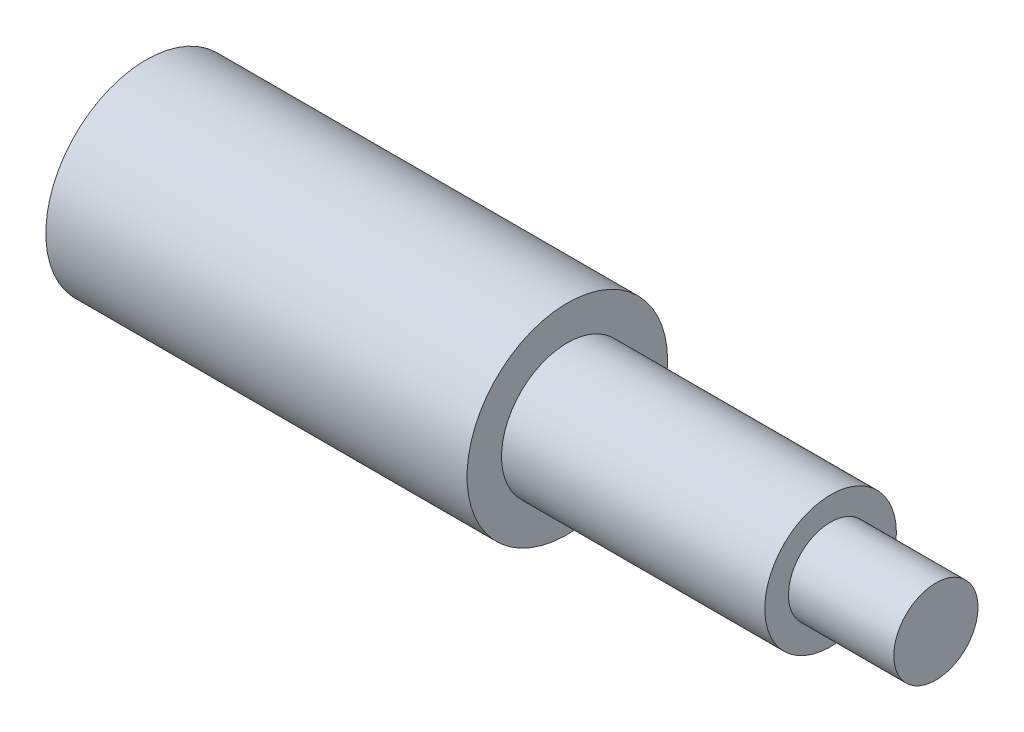
ISO-10303-21;
HEADER;
FILE_DESCRIPTION(('STEP AP214'),'2;1');
FILE_NAME('part.step','',(''),(''),'','','');
FILE_SCHEMA(('AUTOMOTIVE_DESIGN { 1 0 10303 214 1 1 1 1 }'));
ENDSEC;
DATA;
#1=APPLICATION_CONTEXT('core data for automotive mechanical design processes');
#2=APPLICATION_PROTOCOL_DEFINITION('international standard','automotive_design',2000,#1);
#3=PRODUCT_CONTEXT('',#1,'mechanical');
#4=PRODUCT('Part','Part','',(#3));
#5=PRODUCT_RELATED_PRODUCT_CATEGORY('part','',(#4));
#6=PRODUCT_DEFINITION_FORMATION('','',#4);
#7=PRODUCT_DEFINITION_CONTEXT('part definition',#1,'design');
#8=PRODUCT_DEFINITION('design','',#6,#7);
#9=PRODUCT_DEFINITION_SHAPE('','',#8);
#10=(LENGTH_UNIT() NAMED_UNIT(*) SI_UNIT(.MILLI.,.METRE.));
#11=(NAMED_UNIT(*) PLANE_ANGLE_UNIT() SI_UNIT($,.RADIAN.));
#12=(NAMED_UNIT(*) SI_UNIT($,.STERADIAN.) SOLID_ANGLE_UNIT());
#13=UNCERTAINTY_MEASURE_WITH_UNIT(LENGTH_MEASURE(1.E-05),#10,'distance_accuracy_value','');
#14=(GEOMETRIC_REPRESENTATION_CONTEXT(3) GLOBAL_UNCERTAINTY_ASSIGNED_CONTEXT((#13)) GLOBAL_UNIT_ASSIGNED_CONTEXT((#10,
#11,#12)) REPRESENTATION_CONTEXT('',''));
#15=CARTESIAN_POINT('',(0.,0.,0.));
#16=DIRECTION('',(0.,0.,1.));
#17=DIRECTION('',(1.,0.,0.));
#18=AXIS2_PLACEMENT_3D('',#15,#16,#17);
#19=CARTESIAN_POINT('',(300.,0.,0.));
#20=DIRECTION('',(-1.,0.,0.));
#21=DIRECTION('',(0.,0.,1.));
#22=AXIS2_PLACEMENT_3D('',#19,#20,#21);
#23=PLANE('',#22);
#24=CARTESIAN_POINT('',(300.,0.,0.));
#25=DIRECTION('',(-1.,0.,0.));
#26=DIRECTION('',(0.,0.,1.));
#27=AXIS2_PLACEMENT_3D('',#24,#25,#26);
#28=CIRCLE('',#27,12.5);
#29=CARTESIAN_POINT('',(300.,0.,12.5));
#30=VERTEX_POINT('',#29);
#31=EDGE_CURVE('E58',#30,#30,#28,.T.);
#32=ORIENTED_EDGE('',*,*,#31,.F.);
#33=EDGE_LOOP('',(#32));
#34=FACE_BOUND('',#33,.T.);
#35=CARTESIAN_POINT('',(300.,0.,0.));
#36=DIRECTION('',(1.,0.,0.));
#37=DIRECTION('',(0.,0.,-1.));
#38=AXIS2_PLACEMENT_3D('',#35,#36,#37);
#39=CIRCLE('',#38,19.05);
#40=CARTESIAN_POINT('',(300.,0.,-19.05));
#41=VERTEX_POINT('',#40);
#42=EDGE_CURVE('E41',#41,#41,#39,.T.);
#43=ORIENTED_EDGE('',*,*,#42,.F.);
#44=EDGE_LOOP('',(#43));
#45=FACE_BOUND('',#44,.T.);
#46=ADVANCED_FACE('F31',(#34,#45),#23,.T.);
#47=CARTESIAN_POINT('',(450.,0.,0.));
#48=DIRECTION('',(1.,0.,0.));
#49=DIRECTION('',(0.,0.,-1.));
#50=AXIS2_PLACEMENT_3D('',#47,#48,#49);
#51=PLANE('',#50);
#52=CARTESIAN_POINT('',(450.,0.,0.));
#53=DIRECTION('',(1.,0.,0.));
#54=DIRECTION('',(0.,0.,-1.));
#55=AXIS2_PLACEMENT_3D('',#52,#53,#54);
#56=CIRCLE('',#55,8.);
#57=CARTESIAN_POINT('',(450.,0.,-8.));
#58=VERTEX_POINT('',#57);
#59=EDGE_CURVE('E10',#58,#58,#56,.T.);
#60=ORIENTED_EDGE('',*,*,#59,.T.);
#61=EDGE_LOOP('',(#60));
#62=FACE_BOUND('',#61,.T.);
#63=ADVANCED_FACE('F77',(#62),#51,.T.);
#64=CARTESIAN_POINT('',(450.,0.,0.));
#65=DIRECTION('',(-1.,0.,0.));
#66=DIRECTION('',(0.,0.,1.));
#67=AXIS2_PLACEMENT_3D('',#64,#65,#66);
#68=CYLINDRICAL_SURFACE('',#67,8.);
#69=ORIENTED_EDGE('',*,*,#59,.F.);
#70=EDGE_LOOP('',(#69));
#71=FACE_BOUND('',#70,.T.);
#72=CARTESIAN_POINT('',(430.,0.,0.));
#73=DIRECTION('',(1.,0.,0.));
#74=DIRECTION('',(0.,0.,-1.));
#75=AXIS2_PLACEMENT_3D('',#72,#73,#74);
#76=CIRCLE('',#75,8.);
#77=CARTESIAN_POINT('',(430.,0.,-8.));
#78=VERTEX_POINT('',#77);
#79=EDGE_CURVE('E51',#78,#78,#76,.T.);
#80=ORIENTED_EDGE('',*,*,#79,.T.);
#81=EDGE_LOOP('',(#80));
#82=FACE_BOUND('',#81,.T.);
#83=ADVANCED_FACE('F82',(#71,#82),#68,.T.);
#84=CARTESIAN_POINT('',(430.,0.,0.));
#85=DIRECTION('',(1.,0.,0.));
#86=DIRECTION('',(0.,0.,-1.));
#87=AXIS2_PLACEMENT_3D('',#84,#85,#86);
#88=PLANE('',#87);
#89=ORIENTED_EDGE('',*,*,#79,.F.);
#90=EDGE_LOOP('',(#89));
#91=FACE_BOUND('',#90,.T.);
#92=CARTESIAN_POINT('',(430.,0.,0.));
#93=DIRECTION('',(1.,0.,0.));
#94=DIRECTION('',(0.,0.,-1.));
#95=AXIS2_PLACEMENT_3D('',#92,#93,#94);
#96=CIRCLE('',#95,12.5);
#97=CARTESIAN_POINT('',(430.,0.,-12.5));
#98=VERTEX_POINT('',#97);
#99=EDGE_CURVE('E37',#98,#98,#96,.T.);
#100=ORIENTED_EDGE('',*,*,#99,.T.);
#101=EDGE_LOOP('',(#100));
#102=FACE_BOUND('',#101,.T.);
#103=ADVANCED_FACE('F100',(#91,#102),#88,.T.);
#104=CARTESIAN_POINT('',(430.,0.,0.));
#105=DIRECTION('',(-1.,0.,0.));
#106=DIRECTION('',(0.,0.,1.));
#107=AXIS2_PLACEMENT_3D('',#104,#105,#106);
#108=CYLINDRICAL_SURFACE('',#107,12.5);
#109=ORIENTED_EDGE('',*,*,#99,.F.);
#110=EDGE_LOOP('',(#109));
#111=FACE_BOUND('',#110,.T.);
#112=CARTESIAN_POINT('',(380.,0.,0.));
#113=DIRECTION('',(1.,0.,0.));
#114=DIRECTION('',(0.,0.,-1.));
#115=AXIS2_PLACEMENT_3D('',#112,#113,#114);
#116=CIRCLE('',#115,12.5);
#117=CARTESIAN_POINT('',(380.,0.,-12.5));
#118=VERTEX_POINT('',#117);
#119=EDGE_CURVE('E49',#118,#118,#116,.T.);
#120=ORIENTED_EDGE('',*,*,#119,.T.);
#121=EDGE_LOOP('',(#120));
#122=FACE_BOUND('',#121,.T.);
#123=ADVANCED_FACE('F96',(#111,#122),#108,.T.);
#124=CARTESIAN_POINT('',(380.,0.,0.));
#125=DIRECTION('',(1.,0.,0.));
#126=DIRECTION('',(0.,0.,-1.));
#127=AXIS2_PLACEMENT_3D('',#124,#125,#126);
#128=PLANE('',#127);
#129=ORIENTED_EDGE('',*,*,#119,.F.);
#130=EDGE_LOOP('',(#129));
#131=FACE_BOUND('',#130,.T.);
#132=CARTESIAN_POINT('',(380.,0.,0.));
#133=DIRECTION('',(1.,0.,0.));
#134=DIRECTION('',(0.,0.,-1.));
#135=AXIS2_PLACEMENT_3D('',#132,#133,#134);
#136=CIRCLE('',#135,19.05);
#137=CARTESIAN_POINT('',(380.,0.,-19.05));
#138=VERTEX_POINT('',#137);
#139=EDGE_CURVE('E46',#138,#138,#136,.T.);
#140=ORIENTED_EDGE('',*,*,#139,.T.);
#141=EDGE_LOOP('',(#140));
#142=FACE_BOUND('',#141,.T.);
#143=ADVANCED_FACE('F67',(#131,#142),#128,.T.);
#144=CARTESIAN_POINT('',(380.,0.,0.));
#145=DIRECTION('',(-1.,0.,0.));
#146=DIRECTION('',(0.,0.,1.));
#147=AXIS2_PLACEMENT_3D('',#144,#145,#146);
#148=CYLINDRICAL_SURFACE('',#147,19.05);
#149=ORIENTED_EDGE('',*,*,#139,.F.);
#150=EDGE_LOOP('',(#149));
#151=FACE_BOUND('',#150,.T.);
#152=ORIENTED_EDGE('',*,*,#42,.T.);
#153=EDGE_LOOP('',(#152));
#154=FACE_BOUND('',#153,.T.);
#155=ADVANCED_FACE('F69',(#151,#154),#148,.T.);
#156=CARTESIAN_POINT('',(350.,0.,0.));
#157=DIRECTION('',(-1.,0.,0.));
#158=DIRECTION('',(0.,0.,1.));
#159=AXIS2_PLACEMENT_3D('',#156,#157,#158);
#160=CYLINDRICAL_SURFACE('',#159,12.5);
#161=CARTESIAN_POINT('',(350.,0.,0.));
#162=DIRECTION('',(-1.,0.,0.));
#163=DIRECTION('',(0.,0.,1.));
#164=AXIS2_PLACEMENT_3D('',#161,#162,#163);
#165=CIRCLE('',#164,12.5);
#166=CARTESIAN_POINT('',(350.,0.,12.5));
#167=VERTEX_POINT('',#166);
#168=EDGE_CURVE('E53',#167,#167,#165,.T.);
#169=ORIENTED_EDGE('',*,*,#168,.F.);
#170=EDGE_LOOP('',(#169));
#171=FACE_BOUND('',#170,.T.);
#172=ORIENTED_EDGE('',*,*,#31,.T.);
#173=EDGE_LOOP('',(#172));
#174=FACE_BOUND('',#173,.T.);
#175=ADVANCED_FACE('F72',(#171,#174),#160,.F.);
#176=CARTESIAN_POINT('',(350.,0.,0.));
#177=DIRECTION('',(-1.,0.,0.));
#178=DIRECTION('',(0.,0.,1.));
#179=AXIS2_PLACEMENT_3D('',#176,#177,#178);
#180=PLANE('',#179);
#181=ORIENTED_EDGE('',*,*,#168,.T.);
#182=EDGE_LOOP('',(#181));
#183=FACE_BOUND('',#182,.T.);
#184=ADVANCED_FACE('F85',(#183),#180,.T.);
#185=CLOSED_SHELL('',(#46,#63,#83,#103,#123,#143,#155,#175,#184));
#186=MANIFOLD_SOLID_BREP('B2',#185);
#187=ADVANCED_BREP_SHAPE_REPRESENTATION('',(#18,#186),#14);
#188=SHAPE_DEFINITION_REPRESENTATION(#9,#187);
ENDSEC;
END-ISO-10303-21;
